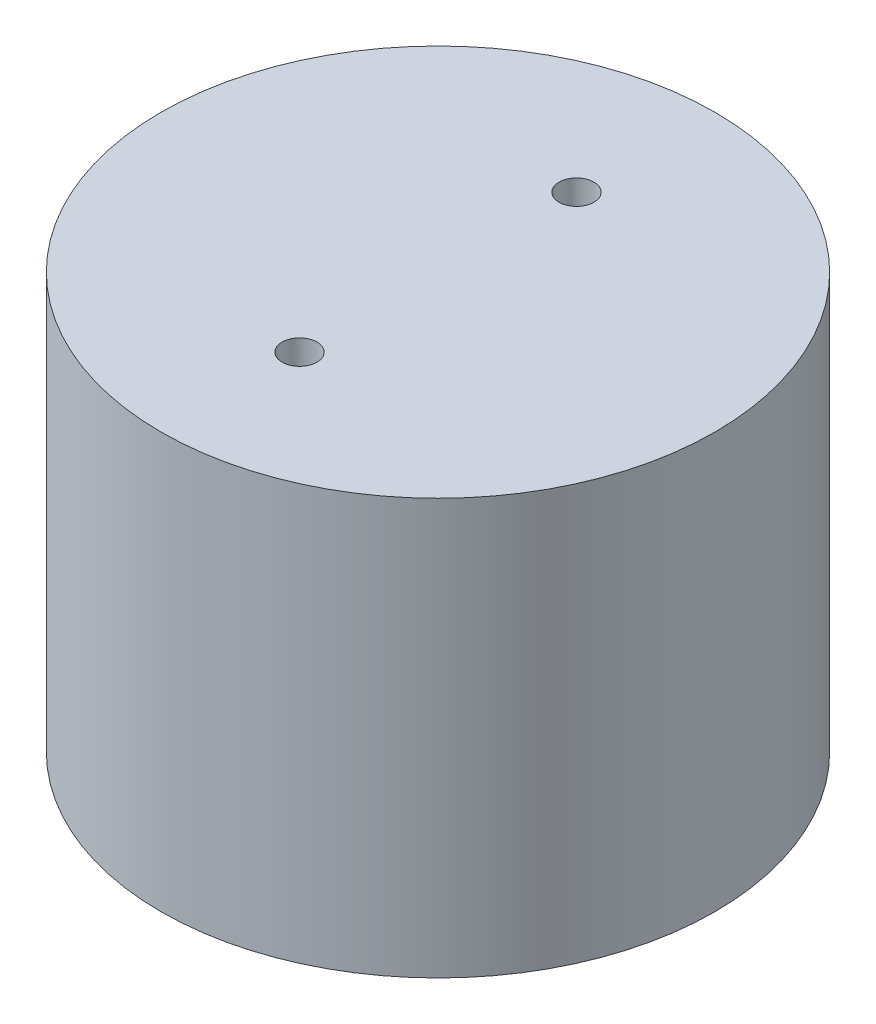
ISO-10303-21;
HEADER;
FILE_DESCRIPTION(('STEP AP214'),'2;1');
FILE_NAME('part.step','',(''),(''),'','','');
FILE_SCHEMA(('AUTOMOTIVE_DESIGN { 1 0 10303 214 1 1 1 1 }'));
ENDSEC;
DATA;
#1=APPLICATION_CONTEXT('core data for automotive mechanical design processes');
#2=APPLICATION_PROTOCOL_DEFINITION('international standard','automotive_design',2000,#1);
#3=PRODUCT_CONTEXT('',#1,'mechanical');
#4=PRODUCT('Part','Part','',(#3));
#5=PRODUCT_RELATED_PRODUCT_CATEGORY('part','',(#4));
#6=PRODUCT_DEFINITION_FORMATION('','',#4);
#7=PRODUCT_DEFINITION_CONTEXT('part definition',#1,'design');
#8=PRODUCT_DEFINITION('design','',#6,#7);
#9=PRODUCT_DEFINITION_SHAPE('','',#8);
#10=(LENGTH_UNIT() NAMED_UNIT(*) SI_UNIT(.MILLI.,.METRE.));
#11=(NAMED_UNIT(*) PLANE_ANGLE_UNIT() SI_UNIT($,.RADIAN.));
#12=(NAMED_UNIT(*) SI_UNIT($,.STERADIAN.) SOLID_ANGLE_UNIT());
#13=UNCERTAINTY_MEASURE_WITH_UNIT(LENGTH_MEASURE(1.E-05),#10,'distance_accuracy_value','');
#14=(GEOMETRIC_REPRESENTATION_CONTEXT(3) GLOBAL_UNCERTAINTY_ASSIGNED_CONTEXT((#13)) GLOBAL_UNIT_ASSIGNED_CONTEXT((#10,
#11,#12)) REPRESENTATION_CONTEXT('',''));
#15=CARTESIAN_POINT('',(0.,0.,0.));
#16=DIRECTION('',(0.,0.,1.));
#17=DIRECTION('',(1.,0.,0.));
#18=AXIS2_PLACEMENT_3D('',#15,#16,#17);
#19=CARTESIAN_POINT('',(0.,38.1,0.));
#20=DIRECTION('',(0.,-1.,0.));
#21=DIRECTION('',(0.,0.,-1.));
#22=AXIS2_PLACEMENT_3D('',#19,#20,#21);
#23=CYLINDRICAL_SURFACE('',#22,25.4);
#24=CARTESIAN_POINT('',(0.,38.1,0.));
#25=DIRECTION('',(0.,1.,0.));
#26=DIRECTION('',(0.,0.,1.));
#27=AXIS2_PLACEMENT_3D('',#24,#25,#26);
#28=CIRCLE('',#27,25.4);
#29=CARTESIAN_POINT('',(0.,38.1,-25.4));
#30=VERTEX_POINT('',#29);
#31=EDGE_CURVE('E13',#30,#30,#28,.T.);
#32=CARTESIAN_POINT('',(0.,0.,0.));
#33=DIRECTION('',(0.,1.,0.));
#34=DIRECTION('',(0.,0.,1.));
#35=AXIS2_PLACEMENT_3D('',#32,#33,#34);
#36=CIRCLE('',#35,25.4);
#37=CARTESIAN_POINT('',(0.,0.,-25.4));
#38=VERTEX_POINT('',#37);
#39=EDGE_CURVE('E59',#38,#38,#36,.T.);
#40=CARTESIAN_POINT('',(0.,38.1,-25.4));
#41=CARTESIAN_POINT('',(0.,37.703125,-25.4));
#42=CARTESIAN_POINT('',(0.,37.30625,-25.4));
#43=CARTESIAN_POINT('',(0.,36.5125,-25.4));
#44=CARTESIAN_POINT('',(0.,36.115625,-25.4));
#45=CARTESIAN_POINT('',(0.,35.321875,-25.4));
#46=CARTESIAN_POINT('',(0.,34.925,-25.4));
#47=CARTESIAN_POINT('',(0.,34.13125,-25.4));
#48=CARTESIAN_POINT('',(0.,33.734375,-25.4));
#49=CARTESIAN_POINT('',(0.,32.940625,-25.4));
#50=CARTESIAN_POINT('',(0.,32.54375,-25.4));
#51=CARTESIAN_POINT('',(0.,31.75,-25.4));
#52=CARTESIAN_POINT('',(0.,31.353125,-25.4));
#53=CARTESIAN_POINT('',(0.,30.559375,-25.4));
#54=CARTESIAN_POINT('',(0.,30.1625,-25.4));
#55=CARTESIAN_POINT('',(0.,29.36875,-25.4));
#56=CARTESIAN_POINT('',(0.,28.971875,-25.4));
#57=CARTESIAN_POINT('',(0.,28.178125,-25.4));
#58=CARTESIAN_POINT('',(0.,27.78125,-25.4));
#59=CARTESIAN_POINT('',(0.,26.9875,-25.4));
#60=CARTESIAN_POINT('',(0.,26.590625,-25.4));
#61=CARTESIAN_POINT('',(0.,25.796875,-25.4));
#62=CARTESIAN_POINT('',(0.,25.4,-25.4));
#63=CARTESIAN_POINT('',(0.,24.60625,-25.4));
#64=CARTESIAN_POINT('',(0.,24.209375,-25.4));
#65=CARTESIAN_POINT('',(0.,23.415625,-25.4));
#66=CARTESIAN_POINT('',(0.,23.01875,-25.4));
#67=CARTESIAN_POINT('',(0.,22.225,-25.4));
#68=CARTESIAN_POINT('',(0.,21.828125,-25.4));
#69=CARTESIAN_POINT('',(0.,21.034375,-25.4));
#70=CARTESIAN_POINT('',(0.,20.6375,-25.4));
#71=CARTESIAN_POINT('',(0.,19.84375,-25.4));
#72=CARTESIAN_POINT('',(0.,19.446875,-25.4));
#73=CARTESIAN_POINT('',(0.,18.653125,-25.4));
#74=CARTESIAN_POINT('',(0.,18.25625,-25.4));
#75=CARTESIAN_POINT('',(0.,17.4625,-25.4));
#76=CARTESIAN_POINT('',(0.,17.065625,-25.4));
#77=CARTESIAN_POINT('',(0.,16.271875,-25.4));
#78=CARTESIAN_POINT('',(0.,15.875,-25.4));
#79=CARTESIAN_POINT('',(0.,15.08125,-25.4));
#80=CARTESIAN_POINT('',(0.,14.684375,-25.4));
#81=CARTESIAN_POINT('',(0.,13.890625,-25.4));
#82=CARTESIAN_POINT('',(0.,13.49375,-25.4));
#83=CARTESIAN_POINT('',(0.,12.7,-25.4));
#84=CARTESIAN_POINT('',(0.,12.303125,-25.4));
#85=CARTESIAN_POINT('',(0.,11.509375,-25.4));
#86=CARTESIAN_POINT('',(0.,11.1125,-25.4));
#87=CARTESIAN_POINT('',(0.,10.31875,-25.4));
#88=CARTESIAN_POINT('',(0.,9.921875,-25.4));
#89=CARTESIAN_POINT('',(0.,9.128125,-25.4));
#90=CARTESIAN_POINT('',(0.,8.73125,-25.4));
#91=CARTESIAN_POINT('',(0.,7.9375,-25.4));
#92=CARTESIAN_POINT('',(0.,7.540625,-25.4));
#93=CARTESIAN_POINT('',(0.,6.746875,-25.4));
#94=CARTESIAN_POINT('',(0.,6.35,-25.4));
#95=CARTESIAN_POINT('',(0.,5.55625,-25.4));
#96=CARTESIAN_POINT('',(0.,5.159375,-25.4));
#97=CARTESIAN_POINT('',(0.,4.365625,-25.4));
#98=CARTESIAN_POINT('',(0.,3.96875,-25.4));
#99=CARTESIAN_POINT('',(0.,3.175,-25.4));
#100=CARTESIAN_POINT('',(0.,2.778125,-25.4));
#101=CARTESIAN_POINT('',(0.,1.984375,-25.4));
#102=CARTESIAN_POINT('',(0.,1.5875,-25.4));
#103=CARTESIAN_POINT('',(0.,0.79375,-25.4));
#104=CARTESIAN_POINT('',(0.,0.396875,-25.4));
#105=CARTESIAN_POINT('',(0.,0.,-25.4));
#106=B_SPLINE_CURVE_WITH_KNOTS('',3,(#40,#41,#42,#43,#44,#45,#46,#47,#48,#49,#50,#51,#52,#53,
#54,#55,#56,#57,#58,#59,#60,#61,#62,#63,#64,#65,#66,#67,#68,#69,#70,#71,#72,#73,#74,#75,#76,#77,
#78,#79,#80,#81,#82,#83,#84,#85,#86,#87,#88,#89,#90,#91,#92,#93,#94,#95,#96,#97,#98,#99,#100,
#101,#102,#103,#104,#105),.UNSPECIFIED.,.F.,.F.,(4,2,2,2,2,2,2,2,2,2,2,2,2,2,2,2,2,2,2,2,2,2,2,
2,2,2,2,2,2,2,2,2,4),(0.,1.19062499999999,2.38124999999999,3.571875,4.7625,5.953125,7.14375,
8.33437499999999,9.525,10.715625,11.90625,13.096875,14.2875,15.478125,16.66875,17.859375,19.05,
20.240625,21.43125,22.621875,23.8125,25.003125,26.19375,27.384375,28.575,29.765625,30.95625,
32.146875,33.3375,34.528125,35.71875,36.909375,38.1),.UNSPECIFIED.);
#107=EDGE_CURVE('BSEAM56',#30,#38,#106,.T.);
#108=ORIENTED_EDGE('',*,*,#31,.F.);
#109=ORIENTED_EDGE('',*,*,#39,.T.);
#110=ORIENTED_EDGE('',*,*,#107,.T.);
#111=ORIENTED_EDGE('',*,*,#107,.F.);
#112=EDGE_LOOP('',(#108,#110,#109,#111));
#113=FACE_BOUND('',#112,.T.);
#114=ADVANCED_FACE('F56',(#113),#23,.T.);
#115=CARTESIAN_POINT('',(0.,38.1,0.));
#116=DIRECTION('',(0.,1.,0.));
#117=DIRECTION('',(0.,0.,1.));
#118=AXIS2_PLACEMENT_3D('',#115,#116,#117);
#119=PLANE('',#118);
#120=CARTESIAN_POINT('',(0.,38.1,12.7));
#121=DIRECTION('',(0.,-1.,0.));
#122=DIRECTION('',(0.,0.,-1.));
#123=AXIS2_PLACEMENT_3D('',#120,#121,#122);
#124=CIRCLE('',#123,1.59999999999999);
#125=CARTESIAN_POINT('',(0.,38.1,11.1));
#126=VERTEX_POINT('',#125);
#127=EDGE_CURVE('E272',#126,#126,#124,.T.);
#128=ORIENTED_EDGE('',*,*,#127,.T.);
#129=EDGE_LOOP('',(#128));
#130=FACE_BOUND('',#129,.T.);
#131=CARTESIAN_POINT('',(0.,38.1,-12.7));
#132=DIRECTION('',(0.,-1.,0.));
#133=DIRECTION('',(0.,0.,-1.));
#134=AXIS2_PLACEMENT_3D('',#131,#132,#133);
#135=CIRCLE('',#134,1.59999999999999);
#136=CARTESIAN_POINT('',(0.,38.1,-14.3));
#137=VERTEX_POINT('',#136);
#138=EDGE_CURVE('E86',#137,#137,#135,.T.);
#139=ORIENTED_EDGE('',*,*,#138,.T.);
#140=EDGE_LOOP('',(#139));
#141=FACE_BOUND('',#140,.T.);
#142=ORIENTED_EDGE('',*,*,#31,.T.);
#143=EDGE_LOOP('',(#142));
#144=FACE_BOUND('',#143,.T.);
#145=ADVANCED_FACE('F100',(#130,#141,#144),#119,.T.);
#146=CARTESIAN_POINT('',(0.,0.,0.));
#147=DIRECTION('',(0.,1.,0.));
#148=DIRECTION('',(0.,0.,1.));
#149=AXIS2_PLACEMENT_3D('',#146,#147,#148);
#150=PLANE('',#149);
#151=CARTESIAN_POINT('',(0.,0.,12.7));
#152=DIRECTION('',(0.,-1.,0.));
#153=DIRECTION('',(0.,0.,-1.));
#154=AXIS2_PLACEMENT_3D('',#151,#152,#153);
#155=CIRCLE('',#154,3.25);
#156=CARTESIAN_POINT('',(0.,0.,9.45));
#157=VERTEX_POINT('',#156);
#158=EDGE_CURVE('E265',#157,#157,#155,.T.);
#159=ORIENTED_EDGE('',*,*,#158,.F.);
#160=EDGE_LOOP('',(#159));
#161=FACE_BOUND('',#160,.T.);
#162=CARTESIAN_POINT('',(0.,0.,-12.7));
#163=DIRECTION('',(0.,-1.,0.));
#164=DIRECTION('',(0.,0.,-1.));
#165=AXIS2_PLACEMENT_3D('',#162,#163,#164);
#166=CIRCLE('',#165,3.25);
#167=CARTESIAN_POINT('',(0.,0.,-15.95));
#168=VERTEX_POINT('',#167);
#169=EDGE_CURVE('E275',#168,#168,#166,.T.);
#170=ORIENTED_EDGE('',*,*,#169,.F.);
#171=EDGE_LOOP('',(#170));
#172=FACE_BOUND('',#171,.T.);
#173=CARTESIAN_POINT('',(-12.7,0.,0.));
#174=DIRECTION('',(0.,-1.,0.));
#175=DIRECTION('',(0.,0.,-1.));
#176=AXIS2_PLACEMENT_3D('',#173,#174,#175);
#177=CIRCLE('',#176,2.55269999999999);
#178=CARTESIAN_POINT('',(-12.7,0.,-2.55269999999999));
#179=VERTEX_POINT('',#178);
#180=EDGE_CURVE('E80',#179,#179,#177,.T.);
#181=ORIENTED_EDGE('',*,*,#180,.F.);
#182=EDGE_LOOP('',(#181));
#183=FACE_BOUND('',#182,.T.);
#184=CARTESIAN_POINT('',(12.7,0.,0.));
#185=DIRECTION('',(0.,-1.,0.));
#186=DIRECTION('',(0.,0.,-1.));
#187=AXIS2_PLACEMENT_3D('',#184,#185,#186);
#188=CIRCLE('',#187,2.55269999999999);
#189=CARTESIAN_POINT('',(12.7,0.,-2.55269999999999));
#190=VERTEX_POINT('',#189);
#191=EDGE_CURVE('E79',#190,#190,#188,.T.);
#192=ORIENTED_EDGE('',*,*,#191,.F.);
#193=EDGE_LOOP('',(#192));
#194=FACE_BOUND('',#193,.T.);
#195=ORIENTED_EDGE('',*,*,#39,.F.);
#196=EDGE_LOOP('',(#195));
#197=FACE_BOUND('',#196,.T.);
#198=ADVANCED_FACE('F97',(#161,#172,#183,#194,#197),#150,.F.);
#199=CARTESIAN_POINT('',(12.7,15.875,0.));
#200=DIRECTION('',(0.,-1.,0.));
#201=DIRECTION('',(0.,0.,-1.));
#202=AXIS2_PLACEMENT_3D('',#199,#200,#201);
#203=CONICAL_SURFACE('',#202,2.5527,1.02974425867665);
#204=CARTESIAN_POINT('',(12.7,17.4088169021917,0.));
#205=VERTEX_POINT('',#204);
#206=VERTEX_LOOP('',#205);
#207=FACE_BOUND('',#206,.T.);
#208=CARTESIAN_POINT('',(12.7,15.875,0.));
#209=DIRECTION('',(0.,-1.,0.));
#210=DIRECTION('',(0.,0.,-1.));
#211=AXIS2_PLACEMENT_3D('',#208,#209,#210);
#212=CIRCLE('',#211,2.5527);
#213=CARTESIAN_POINT('',(12.7,15.875,-2.5527));
#214=VERTEX_POINT('',#213);
#215=EDGE_CURVE('E83',#214,#214,#212,.T.);
#216=ORIENTED_EDGE('',*,*,#215,.T.);
#217=EDGE_LOOP('',(#216));
#218=FACE_BOUND('',#217,.T.);
#219=ADVANCED_FACE('F99',(#207,#218),#203,.F.);
#220=CARTESIAN_POINT('',(12.7,0.,0.));
#221=DIRECTION('',(0.,-1.,0.));
#222=DIRECTION('',(0.,0.,-1.));
#223=AXIS2_PLACEMENT_3D('',#220,#221,#222);
#224=CYLINDRICAL_SURFACE('',#223,2.55269999999999);
#225=ORIENTED_EDGE('',*,*,#215,.F.);
#226=EDGE_LOOP('',(#225));
#227=FACE_BOUND('',#226,.T.);
#228=ORIENTED_EDGE('',*,*,#191,.T.);
#229=EDGE_LOOP('',(#228));
#230=FACE_BOUND('',#229,.T.);
#231=ADVANCED_FACE('F73',(#227,#230),#224,.F.);
#232=CARTESIAN_POINT('',(-12.7,15.875,0.));
#233=DIRECTION('',(0.,-1.,0.));
#234=DIRECTION('',(0.,0.,-1.));
#235=AXIS2_PLACEMENT_3D('',#232,#233,#234);
#236=CONICAL_SURFACE('',#235,2.5527,1.02974425867665);
#237=CARTESIAN_POINT('',(-12.7,17.4088169021917,0.));
#238=VERTEX_POINT('',#237);
#239=VERTEX_LOOP('',#238);
#240=FACE_BOUND('',#239,.T.);
#241=CARTESIAN_POINT('',(-12.7,15.875,0.));
#242=DIRECTION('',(0.,-1.,0.));
#243=DIRECTION('',(0.,0.,-1.));
#244=AXIS2_PLACEMENT_3D('',#241,#242,#243);
#245=CIRCLE('',#244,2.5527);
#246=CARTESIAN_POINT('',(-12.7,15.875,-2.5527));
#247=VERTEX_POINT('',#246);
#248=EDGE_CURVE('E77',#247,#247,#245,.T.);
#249=ORIENTED_EDGE('',*,*,#248,.T.);
#250=EDGE_LOOP('',(#249));
#251=FACE_BOUND('',#250,.T.);
#252=ADVANCED_FACE('F69',(#240,#251),#236,.F.);
#253=CARTESIAN_POINT('',(-12.7,0.,0.));
#254=DIRECTION('',(0.,-1.,0.));
#255=DIRECTION('',(0.,0.,-1.));
#256=AXIS2_PLACEMENT_3D('',#253,#254,#255);
#257=CYLINDRICAL_SURFACE('',#256,2.55269999999999);
#258=ORIENTED_EDGE('',*,*,#248,.F.);
#259=EDGE_LOOP('',(#258));
#260=FACE_BOUND('',#259,.T.);
#261=ORIENTED_EDGE('',*,*,#180,.T.);
#262=EDGE_LOOP('',(#261));
#263=FACE_BOUND('',#262,.T.);
#264=ADVANCED_FACE('F72',(#260,#263),#257,.F.);
#265=CARTESIAN_POINT('',(0.,0.,-12.7));
#266=DIRECTION('',(0.,-1.,0.));
#267=DIRECTION('',(0.,0.,-1.));
#268=AXIS2_PLACEMENT_3D('',#265,#266,#267);
#269=CYLINDRICAL_SURFACE('',#268,1.59999999999999);
#270=ORIENTED_EDGE('',*,*,#138,.F.);
#271=EDGE_LOOP('',(#270));
#272=FACE_BOUND('',#271,.T.);
#273=CARTESIAN_POINT('',(0.,4.999996,-12.7));
#274=DIRECTION('',(0.,-1.,0.));
#275=DIRECTION('',(0.,0.,-1.));
#276=AXIS2_PLACEMENT_3D('',#273,#274,#275);
#277=CIRCLE('',#276,1.6);
#278=CARTESIAN_POINT('',(0.,4.999996,-14.3));
#279=VERTEX_POINT('',#278);
#280=EDGE_CURVE('E281',#279,#279,#277,.T.);
#281=ORIENTED_EDGE('',*,*,#280,.T.);
#282=EDGE_LOOP('',(#281));
#283=FACE_BOUND('',#282,.T.);
#284=ADVANCED_FACE('F139',(#272,#283),#269,.F.);
#285=CARTESIAN_POINT('',(1.60000000000001,4.999996,-12.7));
#286=DIRECTION('',(0.,1.,0.));
#287=DIRECTION('',(0.,0.,1.));
#288=AXIS2_PLACEMENT_3D('',#285,#286,#287);
#289=PLANE('',#288);
#290=ORIENTED_EDGE('',*,*,#280,.F.);
#291=EDGE_LOOP('',(#290));
#292=FACE_BOUND('',#291,.T.);
#293=CARTESIAN_POINT('',(0.,4.999996,-12.7));
#294=DIRECTION('',(0.,-1.,0.));
#295=DIRECTION('',(0.,0.,-1.));
#296=AXIS2_PLACEMENT_3D('',#293,#294,#295);
#297=CIRCLE('',#296,3.25);
#298=CARTESIAN_POINT('',(0.,4.999996,-15.95));
#299=VERTEX_POINT('',#298);
#300=EDGE_CURVE('E278',#299,#299,#297,.T.);
#301=ORIENTED_EDGE('',*,*,#300,.T.);
#302=EDGE_LOOP('',(#301));
#303=FACE_BOUND('',#302,.T.);
#304=ADVANCED_FACE('F144',(#292,#303),#289,.F.);
#305=CARTESIAN_POINT('',(0.,0.,-12.7));
#306=DIRECTION('',(0.,-1.,0.));
#307=DIRECTION('',(0.,0.,-1.));
#308=AXIS2_PLACEMENT_3D('',#305,#306,#307);
#309=CYLINDRICAL_SURFACE('',#308,3.25);
#310=ORIENTED_EDGE('',*,*,#300,.F.);
#311=EDGE_LOOP('',(#310));
#312=FACE_BOUND('',#311,.T.);
#313=ORIENTED_EDGE('',*,*,#169,.T.);
#314=EDGE_LOOP('',(#313));
#315=FACE_BOUND('',#314,.T.);
#316=ADVANCED_FACE('F155',(#312,#315),#309,.F.);
#317=CARTESIAN_POINT('',(0.,0.,12.7));
#318=DIRECTION('',(0.,-1.,0.));
#319=DIRECTION('',(0.,0.,-1.));
#320=AXIS2_PLACEMENT_3D('',#317,#318,#319);
#321=CYLINDRICAL_SURFACE('',#320,1.59999999999999);
#322=ORIENTED_EDGE('',*,*,#127,.F.);
#323=EDGE_LOOP('',(#322));
#324=FACE_BOUND('',#323,.T.);
#325=CARTESIAN_POINT('',(0.,4.999996,12.7));
#326=DIRECTION('',(0.,-1.,0.));
#327=DIRECTION('',(0.,0.,-1.));
#328=AXIS2_PLACEMENT_3D('',#325,#326,#327);
#329=CIRCLE('',#328,1.6);
#330=CARTESIAN_POINT('',(0.,4.999996,11.1));
#331=VERTEX_POINT('',#330);
#332=EDGE_CURVE('E267',#331,#331,#329,.T.);
#333=ORIENTED_EDGE('',*,*,#332,.T.);
#334=EDGE_LOOP('',(#333));
#335=FACE_BOUND('',#334,.T.);
#336=ADVANCED_FACE('F165',(#324,#335),#321,.F.);
#337=CARTESIAN_POINT('',(1.6,4.999996,12.7));
#338=DIRECTION('',(0.,1.,0.));
#339=DIRECTION('',(0.,0.,1.));
#340=AXIS2_PLACEMENT_3D('',#337,#338,#339);
#341=PLANE('',#340);
#342=ORIENTED_EDGE('',*,*,#332,.F.);
#343=EDGE_LOOP('',(#342));
#344=FACE_BOUND('',#343,.T.);
#345=CARTESIAN_POINT('',(0.,4.999996,12.7));
#346=DIRECTION('',(0.,-1.,0.));
#347=DIRECTION('',(0.,0.,-1.));
#348=AXIS2_PLACEMENT_3D('',#345,#346,#347);
#349=CIRCLE('',#348,3.25);
#350=CARTESIAN_POINT('',(0.,4.999996,9.45));
#351=VERTEX_POINT('',#350);
#352=EDGE_CURVE('E263',#351,#351,#349,.T.);
#353=ORIENTED_EDGE('',*,*,#352,.T.);
#354=EDGE_LOOP('',(#353));
#355=FACE_BOUND('',#354,.T.);
#356=ADVANCED_FACE('F175',(#344,#355),#341,.F.);
#357=CARTESIAN_POINT('',(0.,0.,12.7));
#358=DIRECTION('',(0.,-1.,0.));
#359=DIRECTION('',(0.,0.,-1.));
#360=AXIS2_PLACEMENT_3D('',#357,#358,#359);
#361=CYLINDRICAL_SURFACE('',#360,3.25);
#362=ORIENTED_EDGE('',*,*,#352,.F.);
#363=EDGE_LOOP('',(#362));
#364=FACE_BOUND('',#363,.T.);
#365=ORIENTED_EDGE('',*,*,#158,.T.);
#366=EDGE_LOOP('',(#365));
#367=FACE_BOUND('',#366,.T.);
#368=ADVANCED_FACE('F185',(#364,#367),#361,.F.);
#369=CLOSED_SHELL('',(#114,#145,#198,#219,#231,#252,#264,#284,#304,#316,#336,#356,#368));
#370=MANIFOLD_SOLID_BREP('B2',#369);
#371=ADVANCED_BREP_SHAPE_REPRESENTATION('',(#18,#370),#14);
#372=SHAPE_DEFINITION_REPRESENTATION(#9,#371);
ENDSEC;
END-ISO-10303-21;
